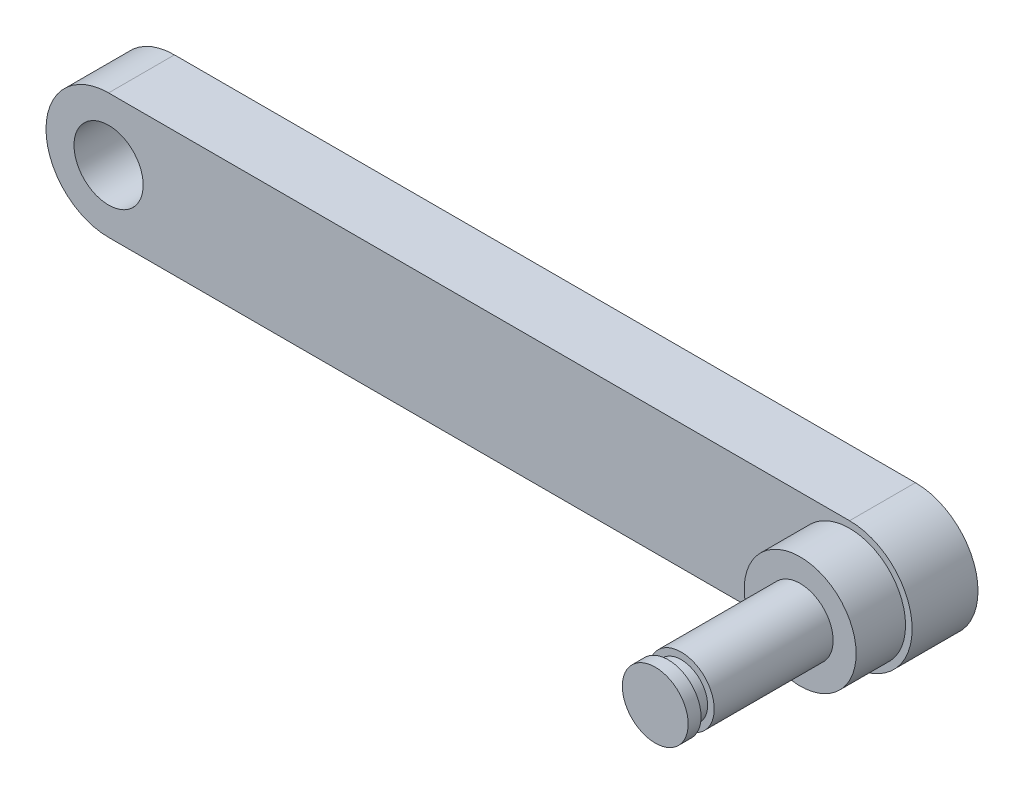
ISO-10303-21;
HEADER;
FILE_DESCRIPTION(('STEP AP214'),'2;1');
FILE_NAME('part.step','',(''),(''),'','','');
FILE_SCHEMA(('AUTOMOTIVE_DESIGN { 1 0 10303 214 1 1 1 1 }'));
ENDSEC;
DATA;
#1=APPLICATION_CONTEXT('core data for automotive mechanical design processes');
#2=APPLICATION_PROTOCOL_DEFINITION('international standard','automotive_design',2000,#1);
#3=PRODUCT_CONTEXT('',#1,'mechanical');
#4=PRODUCT('Part','Part','',(#3));
#5=PRODUCT_RELATED_PRODUCT_CATEGORY('part','',(#4));
#6=PRODUCT_DEFINITION_FORMATION('','',#4);
#7=PRODUCT_DEFINITION_CONTEXT('part definition',#1,'design');
#8=PRODUCT_DEFINITION('design','',#6,#7);
#9=PRODUCT_DEFINITION_SHAPE('','',#8);
#10=(LENGTH_UNIT() NAMED_UNIT(*) SI_UNIT(.MILLI.,.METRE.));
#11=(NAMED_UNIT(*) PLANE_ANGLE_UNIT() SI_UNIT($,.RADIAN.));
#12=(NAMED_UNIT(*) SI_UNIT($,.STERADIAN.) SOLID_ANGLE_UNIT());
#13=UNCERTAINTY_MEASURE_WITH_UNIT(LENGTH_MEASURE(1.E-05),#10,'distance_accuracy_value','');
#14=(GEOMETRIC_REPRESENTATION_CONTEXT(3) GLOBAL_UNCERTAINTY_ASSIGNED_CONTEXT((#13)) GLOBAL_UNIT_ASSIGNED_CONTEXT((#10,
#11,#12)) REPRESENTATION_CONTEXT('',''));
#15=CARTESIAN_POINT('',(0.,0.,0.));
#16=DIRECTION('',(0.,0.,1.));
#17=DIRECTION('',(1.,0.,0.));
#18=AXIS2_PLACEMENT_3D('',#15,#16,#17);
#19=CARTESIAN_POINT('',(45.,0.,15.8));
#20=DIRECTION('',(0.,0.,1.));
#21=DIRECTION('',(1.,0.,0.));
#22=AXIS2_PLACEMENT_3D('',#19,#20,#21);
#23=PLANE('',#22);
#24=CARTESIAN_POINT('',(45.,0.,15.8));
#25=DIRECTION('',(0.,0.,1.));
#26=DIRECTION('',(1.,0.,0.));
#27=AXIS2_PLACEMENT_3D('',#24,#25,#26);
#28=CIRCLE('',#27,2.);
#29=CARTESIAN_POINT('',(47.,0.,15.8));
#30=VERTEX_POINT('',#29);
#31=EDGE_CURVE('E10',#30,#30,#28,.T.);
#32=ORIENTED_EDGE('',*,*,#31,.T.);
#33=EDGE_LOOP('',(#32));
#34=FACE_BOUND('',#33,.T.);
#35=ADVANCED_FACE('F16',(#34),#23,.T.);
#36=CARTESIAN_POINT('',(45.,0.,0.));
#37=DIRECTION('',(0.,0.,-1.));
#38=DIRECTION('',(1.,0.,0.));
#39=AXIS2_PLACEMENT_3D('',#36,#37,#38);
#40=CYLINDRICAL_SURFACE('',#39,2.);
#41=DIRECTION('',(0.,0.,1.));
#42=VECTOR('',#41,1.);
#43=CARTESIAN_POINT('',(47.,0.,0.));
#44=LINE('',#43,#42);
#45=CARTESIAN_POINT('',(47.,0.,15.02));
#46=VERTEX_POINT('',#45);
#47=EDGE_CURVE('E25',#46,#30,#44,.T.);
#48=ORIENTED_EDGE('',*,*,#47,.T.);
#49=ORIENTED_EDGE('',*,*,#31,.F.);
#50=ORIENTED_EDGE('',*,*,#47,.F.);
#51=CARTESIAN_POINT('',(45.,0.,15.02));
#52=DIRECTION('',(0.,0.,-1.));
#53=DIRECTION('',(1.,0.,0.));
#54=AXIS2_PLACEMENT_3D('',#51,#52,#53);
#55=CIRCLE('',#54,2.);
#56=EDGE_CURVE('E120',#46,#46,#55,.T.);
#57=ORIENTED_EDGE('',*,*,#56,.F.);
#58=EDGE_LOOP('',(#48,#49,#50,#57));
#59=FACE_BOUND('',#58,.T.);
#60=ADVANCED_FACE('F129',(#59),#40,.T.);
#61=CARTESIAN_POINT('',(45.,0.,15.02));
#62=DIRECTION('',(0.,0.,1.));
#63=DIRECTION('',(1.,0.,0.));
#64=AXIS2_PLACEMENT_3D('',#61,#62,#63);
#65=PLANE('',#64);
#66=CARTESIAN_POINT('',(45.,0.,15.02));
#67=DIRECTION('',(0.,0.,1.));
#68=DIRECTION('',(1.,0.,0.));
#69=AXIS2_PLACEMENT_3D('',#66,#67,#68);
#70=CIRCLE('',#69,1.6);
#71=CARTESIAN_POINT('',(46.6,0.,15.02));
#72=VERTEX_POINT('',#71);
#73=EDGE_CURVE('E114',#72,#72,#70,.T.);
#74=ORIENTED_EDGE('',*,*,#73,.T.);
#75=EDGE_LOOP('',(#74));
#76=FACE_BOUND('',#75,.T.);
#77=ORIENTED_EDGE('',*,*,#56,.T.);
#78=EDGE_LOOP('',(#77));
#79=FACE_BOUND('',#78,.T.);
#80=ADVANCED_FACE('F18',(#76,#79),#65,.F.);
#81=CARTESIAN_POINT('',(45.,0.,14.22));
#82=DIRECTION('',(0.,0.,-1.));
#83=DIRECTION('',(1.,0.,0.));
#84=AXIS2_PLACEMENT_3D('',#81,#82,#83);
#85=CYLINDRICAL_SURFACE('',#84,1.6);
#86=CARTESIAN_POINT('',(45.,0.,14.22));
#87=DIRECTION('',(0.,0.,1.));
#88=DIRECTION('',(1.,0.,0.));
#89=AXIS2_PLACEMENT_3D('',#86,#87,#88);
#90=CIRCLE('',#89,1.6);
#91=CARTESIAN_POINT('',(46.6,0.,14.22));
#92=VERTEX_POINT('',#91);
#93=EDGE_CURVE('E113',#92,#92,#90,.T.);
#94=ORIENTED_EDGE('',*,*,#93,.T.);
#95=DIRECTION('',(0.,0.,1.));
#96=VECTOR('',#95,1.);
#97=CARTESIAN_POINT('',(46.6,0.,14.22));
#98=LINE('',#97,#96);
#99=EDGE_CURVE('E110',#92,#72,#98,.T.);
#100=ORIENTED_EDGE('',*,*,#99,.T.);
#101=ORIENTED_EDGE('',*,*,#73,.F.);
#102=ORIENTED_EDGE('',*,*,#99,.F.);
#103=EDGE_LOOP('',(#94,#100,#101,#102));
#104=FACE_BOUND('',#103,.T.);
#105=ADVANCED_FACE('F111',(#104),#85,.T.);
#106=CARTESIAN_POINT('',(45.,0.,14.22));
#107=DIRECTION('',(0.,0.,1.));
#108=DIRECTION('',(1.,0.,0.));
#109=AXIS2_PLACEMENT_3D('',#106,#107,#108);
#110=PLANE('',#109);
#111=ORIENTED_EDGE('',*,*,#93,.F.);
#112=EDGE_LOOP('',(#111));
#113=FACE_BOUND('',#112,.T.);
#114=CARTESIAN_POINT('',(45.,0.,14.22));
#115=DIRECTION('',(0.,0.,-1.));
#116=DIRECTION('',(1.,0.,0.));
#117=AXIS2_PLACEMENT_3D('',#114,#115,#116);
#118=CIRCLE('',#117,2.);
#119=CARTESIAN_POINT('',(47.,0.,14.22));
#120=VERTEX_POINT('',#119);
#121=EDGE_CURVE('E159',#120,#120,#118,.T.);
#122=ORIENTED_EDGE('',*,*,#121,.F.);
#123=EDGE_LOOP('',(#122));
#124=FACE_BOUND('',#123,.T.);
#125=ADVANCED_FACE('F138',(#113,#124),#110,.T.);
#126=CARTESIAN_POINT('',(45.,0.,0.));
#127=DIRECTION('',(0.,0.,-1.));
#128=DIRECTION('',(1.,0.,0.));
#129=AXIS2_PLACEMENT_3D('',#126,#127,#128);
#130=CYLINDRICAL_SURFACE('',#129,2.);
#131=ORIENTED_EDGE('',*,*,#121,.T.);
#132=DIRECTION('',(0.,0.,1.));
#133=VECTOR('',#132,1.);
#134=CARTESIAN_POINT('',(47.,0.,0.));
#135=LINE('',#134,#133);
#136=CARTESIAN_POINT('',(47.,0.,7.));
#137=VERTEX_POINT('',#136);
#138=EDGE_CURVE('E122',#137,#120,#135,.T.);
#139=ORIENTED_EDGE('',*,*,#138,.F.);
#140=CARTESIAN_POINT('',(45.,0.,7.));
#141=DIRECTION('',(0.,0.,-1.));
#142=DIRECTION('',(1.,0.,0.));
#143=AXIS2_PLACEMENT_3D('',#140,#141,#142);
#144=CIRCLE('',#143,2.);
#145=EDGE_CURVE('E161',#137,#137,#144,.T.);
#146=ORIENTED_EDGE('',*,*,#145,.F.);
#147=ORIENTED_EDGE('',*,*,#138,.T.);
#148=EDGE_LOOP('',(#131,#139,#146,#147));
#149=FACE_BOUND('',#148,.T.);
#150=ADVANCED_FACE('F148',(#149),#130,.T.);
#151=CARTESIAN_POINT('',(45.,0.,7.));
#152=DIRECTION('',(0.,0.,1.));
#153=DIRECTION('',(1.,0.,0.));
#154=AXIS2_PLACEMENT_3D('',#151,#152,#153);
#155=PLANE('',#154);
#156=ORIENTED_EDGE('',*,*,#145,.T.);
#157=EDGE_LOOP('',(#156));
#158=FACE_BOUND('',#157,.T.);
#159=CARTESIAN_POINT('',(45.,0.,7.));
#160=DIRECTION('',(0.,0.,1.));
#161=DIRECTION('',(1.,0.,0.));
#162=AXIS2_PLACEMENT_3D('',#159,#160,#161);
#163=CIRCLE('',#162,3.4);
#164=CARTESIAN_POINT('',(48.4,0.,7.));
#165=VERTEX_POINT('',#164);
#166=EDGE_CURVE('E167',#165,#165,#163,.T.);
#167=ORIENTED_EDGE('',*,*,#166,.T.);
#168=EDGE_LOOP('',(#167));
#169=FACE_BOUND('',#168,.T.);
#170=ADVANCED_FACE('F146',(#158,#169),#155,.T.);
#171=CARTESIAN_POINT('',(45.,0.,0.));
#172=DIRECTION('',(0.,0.,-1.));
#173=DIRECTION('',(1.,0.,0.));
#174=AXIS2_PLACEMENT_3D('',#171,#172,#173);
#175=CYLINDRICAL_SURFACE('',#174,3.4);
#176=DIRECTION('',(0.,0.,1.));
#177=VECTOR('',#176,1.);
#178=CARTESIAN_POINT('',(48.4,0.,0.));
#179=LINE('',#178,#177);
#180=CARTESIAN_POINT('',(48.4,0.,4.));
#181=VERTEX_POINT('',#180);
#182=EDGE_CURVE('E172',#181,#165,#179,.T.);
#183=ORIENTED_EDGE('',*,*,#182,.T.);
#184=ORIENTED_EDGE('',*,*,#166,.F.);
#185=ORIENTED_EDGE('',*,*,#182,.F.);
#186=CARTESIAN_POINT('',(45.,0.,4.));
#187=DIRECTION('',(0.,0.,-1.));
#188=DIRECTION('',(1.,0.,0.));
#189=AXIS2_PLACEMENT_3D('',#186,#187,#188);
#190=CIRCLE('',#189,3.4);
#191=EDGE_CURVE('E177',#181,#181,#190,.T.);
#192=ORIENTED_EDGE('',*,*,#191,.F.);
#193=EDGE_LOOP('',(#183,#184,#185,#192));
#194=FACE_BOUND('',#193,.T.);
#195=ADVANCED_FACE('F271',(#194),#175,.T.);
#196=CARTESIAN_POINT('',(0.,0.,0.));
#197=DIRECTION('',(0.,0.,-1.));
#198=DIRECTION('',(1.,0.,0.));
#199=AXIS2_PLACEMENT_3D('',#196,#197,#198);
#200=CYLINDRICAL_SURFACE('',#199,2.1);
#201=DIRECTION('',(0.,0.,1.));
#202=VECTOR('',#201,1.);
#203=CARTESIAN_POINT('',(2.1,0.,0.));
#204=LINE('',#203,#202);
#205=CARTESIAN_POINT('',(2.1,0.,0.));
#206=VERTEX_POINT('',#205);
#207=CARTESIAN_POINT('',(2.1,0.,4.));
#208=VERTEX_POINT('',#207);
#209=EDGE_CURVE('E176',#206,#208,#204,.T.);
#210=ORIENTED_EDGE('',*,*,#209,.T.);
#211=CARTESIAN_POINT('',(0.,0.,4.));
#212=DIRECTION('',(0.,0.,1.));
#213=DIRECTION('',(1.,0.,0.));
#214=AXIS2_PLACEMENT_3D('',#211,#212,#213);
#215=CIRCLE('',#214,2.1);
#216=EDGE_CURVE('E181',#208,#208,#215,.T.);
#217=ORIENTED_EDGE('',*,*,#216,.T.);
#218=ORIENTED_EDGE('',*,*,#209,.F.);
#219=CARTESIAN_POINT('',(0.,0.,0.));
#220=DIRECTION('',(0.,0.,1.));
#221=DIRECTION('',(1.,0.,0.));
#222=AXIS2_PLACEMENT_3D('',#219,#220,#221);
#223=CIRCLE('',#222,2.1);
#224=EDGE_CURVE('E186',#206,#206,#223,.T.);
#225=ORIENTED_EDGE('',*,*,#224,.F.);
#226=EDGE_LOOP('',(#210,#217,#218,#225));
#227=FACE_BOUND('',#226,.T.);
#228=ADVANCED_FACE('F269',(#227),#200,.F.);
#229=CARTESIAN_POINT('',(45.,-3.8,0.));
#230=DIRECTION('',(0.,-1.,0.));
#231=DIRECTION('',(0.,0.,-1.));
#232=AXIS2_PLACEMENT_3D('',#229,#230,#231);
#233=PLANE('',#232);
#234=DIRECTION('',(0.,0.,1.));
#235=VECTOR('',#234,1.);
#236=CARTESIAN_POINT('',(45.,-3.8,0.));
#237=LINE('',#236,#235);
#238=CARTESIAN_POINT('',(45.,-3.8,0.));
#239=VERTEX_POINT('',#238);
#240=CARTESIAN_POINT('',(45.,-3.8,4.));
#241=VERTEX_POINT('',#240);
#242=EDGE_CURVE('E192',#239,#241,#237,.T.);
#243=ORIENTED_EDGE('',*,*,#242,.T.);
#244=DIRECTION('',(-1.,0.,0.));
#245=VECTOR('',#244,1.);
#246=CARTESIAN_POINT('',(45.,-3.8,4.));
#247=LINE('',#246,#245);
#248=CARTESIAN_POINT('',(0.,-3.8,4.));
#249=VERTEX_POINT('',#248);
#250=EDGE_CURVE('E182',#241,#249,#247,.T.);
#251=ORIENTED_EDGE('',*,*,#250,.T.);
#252=DIRECTION('',(0.,0.,1.));
#253=VECTOR('',#252,1.);
#254=CARTESIAN_POINT('',(0.,-3.8,0.));
#255=LINE('',#254,#253);
#256=CARTESIAN_POINT('',(0.,-3.8,0.));
#257=VERTEX_POINT('',#256);
#258=EDGE_CURVE('E204',#257,#249,#255,.T.);
#259=ORIENTED_EDGE('',*,*,#258,.F.);
#260=DIRECTION('',(-1.,0.,0.));
#261=VECTOR('',#260,1.);
#262=CARTESIAN_POINT('',(45.,-3.8,0.));
#263=LINE('',#262,#261);
#264=EDGE_CURVE('E183',#239,#257,#263,.T.);
#265=ORIENTED_EDGE('',*,*,#264,.F.);
#266=EDGE_LOOP('',(#243,#251,#259,#265));
#267=FACE_BOUND('',#266,.T.);
#268=ADVANCED_FACE('F238',(#267),#233,.T.);
#269=CARTESIAN_POINT('',(22.5,0.,4.));
#270=DIRECTION('',(0.,0.,-1.));
#271=DIRECTION('',(0.,-1.,0.));
#272=AXIS2_PLACEMENT_3D('',#269,#270,#271);
#273=PLANE('',#272);
#274=ORIENTED_EDGE('',*,*,#216,.F.);
#275=EDGE_LOOP('',(#274));
#276=FACE_BOUND('',#275,.T.);
#277=ORIENTED_EDGE('',*,*,#191,.T.);
#278=EDGE_LOOP('',(#277));
#279=FACE_BOUND('',#278,.T.);
#280=CARTESIAN_POINT('',(0.,0.,4.));
#281=DIRECTION('',(0.,0.,-1.));
#282=DIRECTION('',(0.,-1.,0.));
#283=AXIS2_PLACEMENT_3D('',#280,#281,#282);
#284=CIRCLE('',#283,3.8);
#285=CARTESIAN_POINT('',(0.,3.8,4.));
#286=VERTEX_POINT('',#285);
#287=EDGE_CURVE('E199',#249,#286,#284,.T.);
#288=ORIENTED_EDGE('',*,*,#287,.F.);
#289=ORIENTED_EDGE('',*,*,#250,.F.);
#290=CARTESIAN_POINT('',(45.,0.,4.));
#291=DIRECTION('',(0.,0.,-1.));
#292=DIRECTION('',(0.,1.,0.));
#293=AXIS2_PLACEMENT_3D('',#290,#291,#292);
#294=CIRCLE('',#293,3.8);
#295=CARTESIAN_POINT('',(45.,3.8,4.));
#296=VERTEX_POINT('',#295);
#297=EDGE_CURVE('E188',#296,#241,#294,.T.);
#298=ORIENTED_EDGE('',*,*,#297,.F.);
#299=DIRECTION('',(1.,0.,0.));
#300=VECTOR('',#299,1.);
#301=CARTESIAN_POINT('',(0.,3.8,4.));
#302=LINE('',#301,#300);
#303=EDGE_CURVE('E219',#286,#296,#302,.T.);
#304=ORIENTED_EDGE('',*,*,#303,.F.);
#305=EDGE_LOOP('',(#288,#289,#298,#304));
#306=FACE_BOUND('',#305,.T.);
#307=ADVANCED_FACE('F242',(#276,#279,#306),#273,.F.);
#308=CARTESIAN_POINT('',(22.5,0.,0.));
#309=DIRECTION('',(0.,0.,-1.));
#310=DIRECTION('',(0.,-1.,0.));
#311=AXIS2_PLACEMENT_3D('',#308,#309,#310);
#312=PLANE('',#311);
#313=ORIENTED_EDGE('',*,*,#224,.T.);
#314=EDGE_LOOP('',(#313));
#315=FACE_BOUND('',#314,.T.);
#316=DIRECTION('',(1.,0.,0.));
#317=VECTOR('',#316,1.);
#318=CARTESIAN_POINT('',(0.,3.8,0.));
#319=LINE('',#318,#317);
#320=CARTESIAN_POINT('',(0.,3.8,0.));
#321=VERTEX_POINT('',#320);
#322=CARTESIAN_POINT('',(45.,3.8,0.));
#323=VERTEX_POINT('',#322);
#324=EDGE_CURVE('E208',#321,#323,#319,.T.);
#325=ORIENTED_EDGE('',*,*,#324,.T.);
#326=CARTESIAN_POINT('',(45.,0.,0.));
#327=DIRECTION('',(0.,0.,-1.));
#328=DIRECTION('',(0.,1.,0.));
#329=AXIS2_PLACEMENT_3D('',#326,#327,#328);
#330=CIRCLE('',#329,3.8);
#331=EDGE_CURVE('E187',#323,#239,#330,.T.);
#332=ORIENTED_EDGE('',*,*,#331,.T.);
#333=ORIENTED_EDGE('',*,*,#264,.T.);
#334=CARTESIAN_POINT('',(0.,0.,0.));
#335=DIRECTION('',(0.,0.,-1.));
#336=DIRECTION('',(0.,-1.,0.));
#337=AXIS2_PLACEMENT_3D('',#334,#335,#336);
#338=CIRCLE('',#337,3.8);
#339=EDGE_CURVE('E193',#257,#321,#338,.T.);
#340=ORIENTED_EDGE('',*,*,#339,.T.);
#341=EDGE_LOOP('',(#325,#332,#333,#340));
#342=FACE_BOUND('',#341,.T.);
#343=ADVANCED_FACE('F249',(#315,#342),#312,.T.);
#344=CARTESIAN_POINT('',(45.,0.,0.));
#345=DIRECTION('',(0.,0.,-1.));
#346=DIRECTION('',(0.,1.,0.));
#347=AXIS2_PLACEMENT_3D('',#344,#345,#346);
#348=CYLINDRICAL_SURFACE('',#347,3.8);
#349=DIRECTION('',(0.,0.,1.));
#350=VECTOR('',#349,1.);
#351=CARTESIAN_POINT('',(45.,3.8,0.));
#352=LINE('',#351,#350);
#353=EDGE_CURVE('E215',#323,#296,#352,.T.);
#354=ORIENTED_EDGE('',*,*,#353,.T.);
#355=ORIENTED_EDGE('',*,*,#297,.T.);
#356=ORIENTED_EDGE('',*,*,#242,.F.);
#357=ORIENTED_EDGE('',*,*,#331,.F.);
#358=EDGE_LOOP('',(#354,#355,#356,#357));
#359=FACE_BOUND('',#358,.T.);
#360=ADVANCED_FACE('F254',(#359),#348,.T.);
#361=CARTESIAN_POINT('',(0.,0.,0.));
#362=DIRECTION('',(0.,0.,-1.));
#363=DIRECTION('',(0.,-1.,0.));
#364=AXIS2_PLACEMENT_3D('',#361,#362,#363);
#365=CYLINDRICAL_SURFACE('',#364,3.8);
#366=ORIENTED_EDGE('',*,*,#258,.T.);
#367=ORIENTED_EDGE('',*,*,#287,.T.);
#368=DIRECTION('',(0.,0.,1.));
#369=VECTOR('',#368,1.);
#370=CARTESIAN_POINT('',(0.,3.8,0.));
#371=LINE('',#370,#369);
#372=EDGE_CURVE('E226',#321,#286,#371,.T.);
#373=ORIENTED_EDGE('',*,*,#372,.F.);
#374=ORIENTED_EDGE('',*,*,#339,.F.);
#375=EDGE_LOOP('',(#366,#367,#373,#374));
#376=FACE_BOUND('',#375,.T.);
#377=ADVANCED_FACE('F246',(#376),#365,.T.);
#378=CARTESIAN_POINT('',(0.,3.8,0.));
#379=DIRECTION('',(0.,1.,0.));
#380=DIRECTION('',(1.,0.,0.));
#381=AXIS2_PLACEMENT_3D('',#378,#379,#380);
#382=PLANE('',#381);
#383=ORIENTED_EDGE('',*,*,#372,.T.);
#384=ORIENTED_EDGE('',*,*,#303,.T.);
#385=ORIENTED_EDGE('',*,*,#353,.F.);
#386=ORIENTED_EDGE('',*,*,#324,.F.);
#387=EDGE_LOOP('',(#383,#384,#385,#386));
#388=FACE_BOUND('',#387,.T.);
#389=ADVANCED_FACE('F252',(#388),#382,.T.);
#390=CLOSED_SHELL('',(#35,#60,#80,#105,#125,#150,#170,#195,#228,#268,#307,#343,#360,#377,#389));
#391=MANIFOLD_SOLID_BREP('B1',#390);
#392=ADVANCED_BREP_SHAPE_REPRESENTATION('',(#18,#391),#14);
#393=SHAPE_DEFINITION_REPRESENTATION(#9,#392);
ENDSEC;
END-ISO-10303-21;
